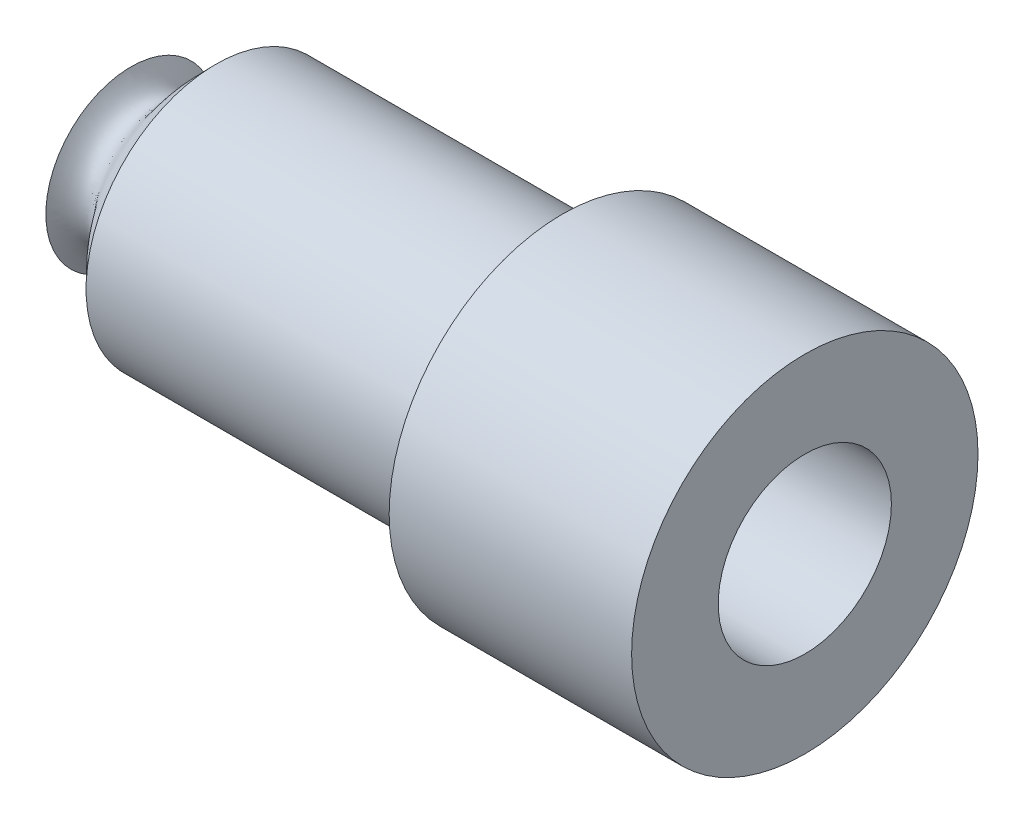
ISO-10303-21;
HEADER;
FILE_DESCRIPTION(('STEP AP214'),'2;1');
FILE_NAME('part.step','',(''),(''),'','','');
FILE_SCHEMA(('AUTOMOTIVE_DESIGN { 1 0 10303 214 1 1 1 1 }'));
ENDSEC;
DATA;
#1=APPLICATION_CONTEXT('core data for automotive mechanical design processes');
#2=APPLICATION_PROTOCOL_DEFINITION('international standard','automotive_design',2000,#1);
#3=PRODUCT_CONTEXT('',#1,'mechanical');
#4=PRODUCT('Part','Part','',(#3));
#5=PRODUCT_RELATED_PRODUCT_CATEGORY('part','',(#4));
#6=PRODUCT_DEFINITION_FORMATION('','',#4);
#7=PRODUCT_DEFINITION_CONTEXT('part definition',#1,'design');
#8=PRODUCT_DEFINITION('design','',#6,#7);
#9=PRODUCT_DEFINITION_SHAPE('','',#8);
#10=(LENGTH_UNIT() NAMED_UNIT(*) SI_UNIT(.MILLI.,.METRE.));
#11=(NAMED_UNIT(*) PLANE_ANGLE_UNIT() SI_UNIT($,.RADIAN.));
#12=(NAMED_UNIT(*) SI_UNIT($,.STERADIAN.) SOLID_ANGLE_UNIT());
#13=UNCERTAINTY_MEASURE_WITH_UNIT(LENGTH_MEASURE(1.E-05),#10,'distance_accuracy_value','');
#14=(GEOMETRIC_REPRESENTATION_CONTEXT(3) GLOBAL_UNCERTAINTY_ASSIGNED_CONTEXT((#13)) GLOBAL_UNIT_ASSIGNED_CONTEXT((#10,
#11,#12)) REPRESENTATION_CONTEXT('',''));
#15=CARTESIAN_POINT('',(0.,0.,0.));
#16=DIRECTION('',(0.,0.,1.));
#17=DIRECTION('',(1.,0.,0.));
#18=AXIS2_PLACEMENT_3D('',#15,#16,#17);
#19=CARTESIAN_POINT('',(0.,0.,7.5));
#20=CARTESIAN_POINT('',(-1.75285447379806,0.,5.6648154387903));
#21=CARTESIAN_POINT('',(-0.373820614354335,0.,7.24033237643417));
#22=CARTESIAN_POINT('',(-3.90557200219197,0.,2.87995133410362));
#23=CARTESIAN_POINT('',(-4.90877273489114,0.,4.91500000000002));
#24=B_SPLINE_CURVE_WITH_KNOTS('',3,(#19,#20,#21,#22,#23),.UNSPECIFIED.,.F.,.F.,(4,1,4),(0.,
0.780983400628301,1.),.UNSPECIFIED.);
#25=CARTESIAN_POINT('',(0.,0.,0.));
#26=DIRECTION('',(1.,0.,0.));
#27=AXIS1_PLACEMENT('',#25,#26);
#28=SURFACE_OF_REVOLUTION('',#24,#27);
#29=CARTESIAN_POINT('',(-4.90877273489114,0.,0.));
#30=DIRECTION('',(1.,0.,0.));
#31=DIRECTION('',(0.,0.,-1.));
#32=AXIS2_PLACEMENT_3D('',#29,#30,#31);
#33=CIRCLE('',#32,4.915);
#34=CARTESIAN_POINT('',(-4.90877273489114,0.,-4.915));
#35=VERTEX_POINT('',#34);
#36=EDGE_CURVE('E97',#35,#35,#33,.T.);
#37=ORIENTED_EDGE('',*,*,#36,.T.);
#38=EDGE_LOOP('',(#37));
#39=FACE_BOUND('',#38,.T.);
#40=CARTESIAN_POINT('',(0.,0.,0.));
#41=DIRECTION('',(1.,0.,0.));
#42=DIRECTION('',(0.,0.,-1.));
#43=AXIS2_PLACEMENT_3D('',#40,#41,#42);
#44=CIRCLE('',#43,7.5);
#45=CARTESIAN_POINT('',(0.,0.,-7.5));
#46=VERTEX_POINT('',#45);
#47=EDGE_CURVE('E10',#46,#46,#44,.T.);
#48=ORIENTED_EDGE('',*,*,#47,.F.);
#49=EDGE_LOOP('',(#48));
#50=FACE_BOUND('',#49,.T.);
#51=ADVANCED_FACE('F45',(#39,#50),#28,.F.);
#52=CARTESIAN_POINT('',(0.,0.,0.));
#53=DIRECTION('',(1.,0.,0.));
#54=DIRECTION('',(0.,0.,-1.));
#55=AXIS2_PLACEMENT_3D('',#52,#53,#54);
#56=CYLINDRICAL_SURFACE('',#55,7.5);
#57=ORIENTED_EDGE('',*,*,#47,.T.);
#58=EDGE_LOOP('',(#57));
#59=FACE_BOUND('',#58,.T.);
#60=CARTESIAN_POINT('',(20.,0.,0.));
#61=DIRECTION('',(1.,0.,0.));
#62=DIRECTION('',(0.,0.,-1.));
#63=AXIS2_PLACEMENT_3D('',#60,#61,#62);
#64=CIRCLE('',#63,7.5);
#65=CARTESIAN_POINT('',(20.,0.,-7.5));
#66=VERTEX_POINT('',#65);
#67=EDGE_CURVE('E53',#66,#66,#64,.T.);
#68=ORIENTED_EDGE('',*,*,#67,.F.);
#69=EDGE_LOOP('',(#68));
#70=FACE_BOUND('',#69,.T.);
#71=ADVANCED_FACE('F122',(#59,#70),#56,.T.);
#72=CARTESIAN_POINT('',(20.,0.,0.));
#73=DIRECTION('',(-1.,0.,0.));
#74=DIRECTION('',(0.,0.,1.));
#75=AXIS2_PLACEMENT_3D('',#72,#73,#74);
#76=PLANE('',#75);
#77=ORIENTED_EDGE('',*,*,#67,.T.);
#78=EDGE_LOOP('',(#77));
#79=FACE_BOUND('',#78,.T.);
#80=CARTESIAN_POINT('',(20.,0.,0.));
#81=DIRECTION('',(1.,0.,0.));
#82=DIRECTION('',(0.,0.,-1.));
#83=AXIS2_PLACEMENT_3D('',#80,#81,#82);
#84=CIRCLE('',#83,10.);
#85=CARTESIAN_POINT('',(20.,0.,-10.));
#86=VERTEX_POINT('',#85);
#87=EDGE_CURVE('E58',#86,#86,#84,.T.);
#88=ORIENTED_EDGE('',*,*,#87,.F.);
#89=EDGE_LOOP('',(#88));
#90=FACE_BOUND('',#89,.T.);
#91=ADVANCED_FACE('F126',(#79,#90),#76,.T.);
#92=CARTESIAN_POINT('',(0.,0.,0.));
#93=DIRECTION('',(1.,0.,0.));
#94=DIRECTION('',(0.,0.,-1.));
#95=AXIS2_PLACEMENT_3D('',#92,#93,#94);
#96=CYLINDRICAL_SURFACE('',#95,10.);
#97=ORIENTED_EDGE('',*,*,#87,.T.);
#98=EDGE_LOOP('',(#97));
#99=FACE_BOUND('',#98,.T.);
#100=CARTESIAN_POINT('',(34.,0.,0.));
#101=DIRECTION('',(1.,0.,0.));
#102=DIRECTION('',(0.,0.,-1.));
#103=AXIS2_PLACEMENT_3D('',#100,#101,#102);
#104=CIRCLE('',#103,10.);
#105=CARTESIAN_POINT('',(34.,0.,-10.));
#106=VERTEX_POINT('',#105);
#107=EDGE_CURVE('E63',#106,#106,#104,.T.);
#108=ORIENTED_EDGE('',*,*,#107,.F.);
#109=EDGE_LOOP('',(#108));
#110=FACE_BOUND('',#109,.T.);
#111=ADVANCED_FACE('F130',(#99,#110),#96,.T.);
#112=CARTESIAN_POINT('',(34.,0.,0.));
#113=DIRECTION('',(1.,0.,0.));
#114=DIRECTION('',(0.,0.,-1.));
#115=AXIS2_PLACEMENT_3D('',#112,#113,#114);
#116=PLANE('',#115);
#117=ORIENTED_EDGE('',*,*,#107,.T.);
#118=EDGE_LOOP('',(#117));
#119=FACE_BOUND('',#118,.T.);
#120=CARTESIAN_POINT('',(34.,0.,0.));
#121=DIRECTION('',(1.,0.,0.));
#122=DIRECTION('',(0.,0.,-1.));
#123=AXIS2_PLACEMENT_3D('',#120,#121,#122);
#124=CIRCLE('',#123,5.);
#125=CARTESIAN_POINT('',(34.,0.,-5.));
#126=VERTEX_POINT('',#125);
#127=EDGE_CURVE('E69',#126,#126,#124,.T.);
#128=ORIENTED_EDGE('',*,*,#127,.F.);
#129=EDGE_LOOP('',(#128));
#130=FACE_BOUND('',#129,.T.);
#131=ADVANCED_FACE('F136',(#119,#130),#116,.T.);
#132=CARTESIAN_POINT('',(0.,0.,0.));
#133=DIRECTION('',(1.,0.,0.));
#134=DIRECTION('',(0.,0.,-1.));
#135=AXIS2_PLACEMENT_3D('',#132,#133,#134);
#136=CYLINDRICAL_SURFACE('',#135,5.);
#137=CARTESIAN_POINT('',(20.,0.,0.));
#138=DIRECTION('',(1.,0.,0.));
#139=DIRECTION('',(0.,0.,-1.));
#140=AXIS2_PLACEMENT_3D('',#137,#138,#139);
#141=CIRCLE('',#140,5.);
#142=CARTESIAN_POINT('',(20.,0.,-5.));
#143=VERTEX_POINT('',#142);
#144=EDGE_CURVE('E73',#143,#143,#141,.T.);
#145=ORIENTED_EDGE('',*,*,#144,.F.);
#146=EDGE_LOOP('',(#145));
#147=FACE_BOUND('',#146,.T.);
#148=ORIENTED_EDGE('',*,*,#127,.T.);
#149=EDGE_LOOP('',(#148));
#150=FACE_BOUND('',#149,.T.);
#151=ADVANCED_FACE('F140',(#147,#150),#136,.F.);
#152=CARTESIAN_POINT('',(20.,0.,0.));
#153=DIRECTION('',(-1.,0.,0.));
#154=DIRECTION('',(0.,0.,1.));
#155=AXIS2_PLACEMENT_3D('',#152,#153,#154);
#156=PLANE('',#155);
#157=CARTESIAN_POINT('',(20.,0.,0.));
#158=DIRECTION('',(1.,0.,0.));
#159=DIRECTION('',(0.,0.,-1.));
#160=AXIS2_PLACEMENT_3D('',#157,#158,#159);
#161=CIRCLE('',#160,2.5);
#162=CARTESIAN_POINT('',(20.,0.,-2.5));
#163=VERTEX_POINT('',#162);
#164=EDGE_CURVE('E77',#163,#163,#161,.T.);
#165=ORIENTED_EDGE('',*,*,#164,.F.);
#166=EDGE_LOOP('',(#165));
#167=FACE_BOUND('',#166,.T.);
#168=ORIENTED_EDGE('',*,*,#144,.T.);
#169=EDGE_LOOP('',(#168));
#170=FACE_BOUND('',#169,.T.);
#171=ADVANCED_FACE('F144',(#167,#170),#156,.F.);
#172=CARTESIAN_POINT('',(0.,0.,0.));
#173=DIRECTION('',(1.,0.,0.));
#174=DIRECTION('',(0.,0.,-1.));
#175=AXIS2_PLACEMENT_3D('',#172,#173,#174);
#176=CYLINDRICAL_SURFACE('',#175,2.5);
#177=ORIENTED_EDGE('',*,*,#164,.T.);
#178=EDGE_LOOP('',(#177));
#179=FACE_BOUND('',#178,.T.);
#180=CARTESIAN_POINT('',(0.,0.,0.));
#181=DIRECTION('',(1.,0.,0.));
#182=DIRECTION('',(0.,0.,-1.));
#183=AXIS2_PLACEMENT_3D('',#180,#181,#182);
#184=CIRCLE('',#183,2.5);
#185=CARTESIAN_POINT('',(0.,0.,-2.5));
#186=VERTEX_POINT('',#185);
#187=EDGE_CURVE('E81',#186,#186,#184,.T.);
#188=ORIENTED_EDGE('',*,*,#187,.F.);
#189=EDGE_LOOP('',(#188));
#190=FACE_BOUND('',#189,.T.);
#191=ADVANCED_FACE('F148',(#179,#190),#176,.F.);
#192=CARTESIAN_POINT('',(0.,0.,0.));
#193=DIRECTION('',(1.,0.,0.));
#194=DIRECTION('',(0.,0.,-1.));
#195=AXIS2_PLACEMENT_3D('',#192,#193,#194);
#196=CONICAL_SURFACE('',#195,2.5,0.5235987755983);
#197=CARTESIAN_POINT('',(-2.75694323904833,0.,0.));
#198=DIRECTION('',(1.,0.,0.));
#199=DIRECTION('',(0.,0.,-1.));
#200=AXIS2_PLACEMENT_3D('',#197,#198,#199);
#201=CIRCLE('',#200,0.908278078794924);
#202=CARTESIAN_POINT('',(-2.75694323904833,0.,-0.908278078794924));
#203=VERTEX_POINT('',#202);
#204=EDGE_CURVE('E85',#203,#203,#201,.T.);
#205=ORIENTED_EDGE('',*,*,#204,.F.);
#206=EDGE_LOOP('',(#205));
#207=FACE_BOUND('',#206,.T.);
#208=ORIENTED_EDGE('',*,*,#187,.T.);
#209=EDGE_LOOP('',(#208));
#210=FACE_BOUND('',#209,.T.);
#211=ADVANCED_FACE('F152',(#207,#210),#196,.F.);
#212=CARTESIAN_POINT('',(-3.25694323904833,0.,0.));
#213=DIRECTION('',(1.,0.,0.));
#214=DIRECTION('',(0.,0.,-1.));
#215=AXIS2_PLACEMENT_3D('',#212,#213,#214);
#216=TOROIDAL_SURFACE('',#215,1.77430348257936,1.);
#217=CARTESIAN_POINT('',(-3.344098981796,0.,0.));
#218=DIRECTION('',(1.,0.,0.));
#219=DIRECTION('',(0.,0.,-1.));
#220=AXIS2_PLACEMENT_3D('',#217,#218,#219);
#221=CIRCLE('',#220,0.778108784487615);
#222=CARTESIAN_POINT('',(-3.344098981796,0.,-0.778108784487615));
#223=VERTEX_POINT('',#222);
#224=EDGE_CURVE('E89',#223,#223,#221,.T.);
#225=ORIENTED_EDGE('',*,*,#224,.F.);
#226=EDGE_LOOP('',(#225));
#227=FACE_BOUND('',#226,.T.);
#228=ORIENTED_EDGE('',*,*,#204,.T.);
#229=EDGE_LOOP('',(#228));
#230=FACE_BOUND('',#229,.T.);
#231=ADVANCED_FACE('F118',(#227,#230),#216,.T.);
#232=CARTESIAN_POINT('',(-3.344098981796,0.,0.));
#233=DIRECTION('',(-1.,0.,0.));
#234=DIRECTION('',(0.,0.,1.));
#235=AXIS2_PLACEMENT_3D('',#232,#233,#234);
#236=CONICAL_SURFACE('',#235,0.778108784487615,0.0872664625997167);
#237=CARTESIAN_POINT('',(-4.90877273489113,0.,0.));
#238=DIRECTION('',(1.,0.,0.));
#239=DIRECTION('',(0.,0.,-1.));
#240=AXIS2_PLACEMENT_3D('',#237,#238,#239);
#241=CIRCLE('',#240,0.915);
#242=CARTESIAN_POINT('',(-4.90877273489113,0.,-0.915));
#243=VERTEX_POINT('',#242);
#244=EDGE_CURVE('E93',#243,#243,#241,.T.);
#245=ORIENTED_EDGE('',*,*,#244,.F.);
#246=EDGE_LOOP('',(#245));
#247=FACE_BOUND('',#246,.T.);
#248=ORIENTED_EDGE('',*,*,#224,.T.);
#249=EDGE_LOOP('',(#248));
#250=FACE_BOUND('',#249,.T.);
#251=ADVANCED_FACE('F112',(#247,#250),#236,.F.);
#252=CARTESIAN_POINT('',(-4.90877273489113,0.,0.));
#253=DIRECTION('',(-1.,0.,0.));
#254=DIRECTION('',(0.,0.,1.));
#255=AXIS2_PLACEMENT_3D('',#252,#253,#254);
#256=PLANE('',#255);
#257=ORIENTED_EDGE('',*,*,#244,.T.);
#258=EDGE_LOOP('',(#257));
#259=FACE_BOUND('',#258,.T.);
#260=ORIENTED_EDGE('',*,*,#36,.F.);
#261=EDGE_LOOP('',(#260));
#262=FACE_BOUND('',#261,.T.);
#263=ADVANCED_FACE('F110',(#259,#262),#256,.T.);
#264=CLOSED_SHELL('',(#51,#71,#91,#111,#131,#151,#171,#191,#211,#231,#251,#263));
#265=MANIFOLD_SOLID_BREP('B2',#264);
#266=ADVANCED_BREP_SHAPE_REPRESENTATION('',(#18,#265),#14);
#267=SHAPE_DEFINITION_REPRESENTATION(#9,#266);
ENDSEC;
END-ISO-10303-21;
